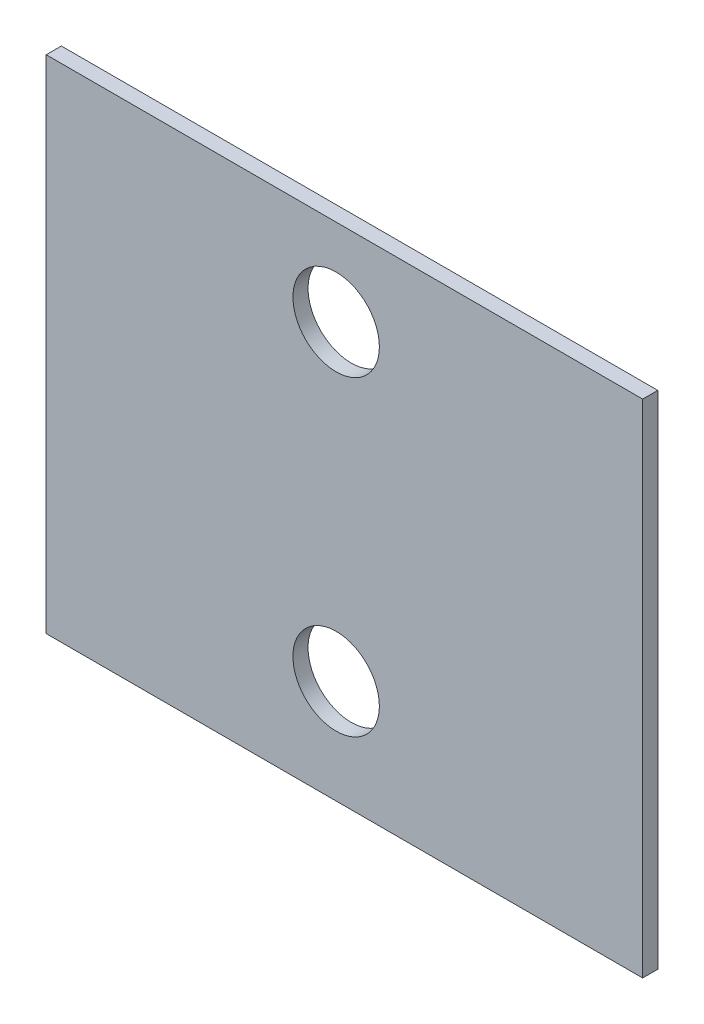
ISO-10303-21;
HEADER;
FILE_DESCRIPTION(('STEP AP214'),'2;1');
FILE_NAME('part.step','',(''),(''),'','','');
FILE_SCHEMA(('AUTOMOTIVE_DESIGN { 1 0 10303 214 1 1 1 1 }'));
ENDSEC;
DATA;
#1=APPLICATION_CONTEXT('core data for automotive mechanical design processes');
#2=APPLICATION_PROTOCOL_DEFINITION('international standard','automotive_design',2000,#1);
#3=PRODUCT_CONTEXT('',#1,'mechanical');
#4=PRODUCT('Part','Part','',(#3));
#5=PRODUCT_RELATED_PRODUCT_CATEGORY('part','',(#4));
#6=PRODUCT_DEFINITION_FORMATION('','',#4);
#7=PRODUCT_DEFINITION_CONTEXT('part definition',#1,'design');
#8=PRODUCT_DEFINITION('design','',#6,#7);
#9=PRODUCT_DEFINITION_SHAPE('','',#8);
#10=(LENGTH_UNIT() NAMED_UNIT(*) SI_UNIT(.MILLI.,.METRE.));
#11=(NAMED_UNIT(*) PLANE_ANGLE_UNIT() SI_UNIT($,.RADIAN.));
#12=(NAMED_UNIT(*) SI_UNIT($,.STERADIAN.) SOLID_ANGLE_UNIT());
#13=UNCERTAINTY_MEASURE_WITH_UNIT(LENGTH_MEASURE(1.E-05),#10,'distance_accuracy_value','');
#14=(GEOMETRIC_REPRESENTATION_CONTEXT(3) GLOBAL_UNCERTAINTY_ASSIGNED_CONTEXT((#13)) GLOBAL_UNIT_ASSIGNED_CONTEXT((#10,
#11,#12)) REPRESENTATION_CONTEXT('',''));
#15=CARTESIAN_POINT('',(0.,0.,0.));
#16=DIRECTION('',(0.,0.,1.));
#17=DIRECTION('',(1.,0.,0.));
#18=AXIS2_PLACEMENT_3D('',#15,#16,#17);
#19=CARTESIAN_POINT('',(0.,0.,1.75));
#20=DIRECTION('',(0.,0.,1.));
#21=DIRECTION('',(1.,0.,0.));
#22=AXIS2_PLACEMENT_3D('',#19,#20,#21);
#23=PLANE('',#22);
#24=CARTESIAN_POINT('',(-2.95837358432269,17.5,1.75));
#25=DIRECTION('',(0.,0.,1.));
#26=DIRECTION('',(1.,0.,0.));
#27=AXIS2_PLACEMENT_3D('',#24,#25,#26);
#28=CIRCLE('',#27,5.);
#29=CARTESIAN_POINT('',(2.04162641567731,17.5,1.75));
#30=VERTEX_POINT('',#29);
#31=EDGE_CURVE('E100',#30,#30,#28,.T.);
#32=ORIENTED_EDGE('',*,*,#31,.F.);
#33=EDGE_LOOP('',(#32));
#34=FACE_BOUND('',#33,.T.);
#35=DIRECTION('',(0.,1.,0.));
#36=VECTOR('',#35,1.);
#37=CARTESIAN_POINT('',(32.5,27.5,1.75));
#38=LINE('',#37,#36);
#39=CARTESIAN_POINT('',(32.5,-30.5,1.75));
#40=VERTEX_POINT('',#39);
#41=CARTESIAN_POINT('',(32.5,27.5,1.75));
#42=VERTEX_POINT('',#41);
#43=EDGE_CURVE('E85',#40,#42,#38,.T.);
#44=ORIENTED_EDGE('',*,*,#43,.T.);
#45=DIRECTION('',(-1.,0.,0.));
#46=VECTOR('',#45,1.);
#47=CARTESIAN_POINT('',(-36.5,27.5,1.75));
#48=LINE('',#47,#46);
#49=CARTESIAN_POINT('',(-36.5,27.5,1.75));
#50=VERTEX_POINT('',#49);
#51=EDGE_CURVE('E80',#42,#50,#48,.T.);
#52=ORIENTED_EDGE('',*,*,#51,.T.);
#53=DIRECTION('',(0.,-1.,0.));
#54=VECTOR('',#53,1.);
#55=CARTESIAN_POINT('',(-36.5,27.5,1.75));
#56=LINE('',#55,#54);
#57=CARTESIAN_POINT('',(-36.5,-30.5,1.75));
#58=VERTEX_POINT('',#57);
#59=EDGE_CURVE('E83',#50,#58,#56,.T.);
#60=ORIENTED_EDGE('',*,*,#59,.T.);
#61=DIRECTION('',(1.,0.,0.));
#62=VECTOR('',#61,1.);
#63=CARTESIAN_POINT('',(-36.5,-30.5,1.75));
#64=LINE('',#63,#62);
#65=EDGE_CURVE('E50',#58,#40,#64,.T.);
#66=ORIENTED_EDGE('',*,*,#65,.T.);
#67=EDGE_LOOP('',(#44,#52,#60,#66));
#68=FACE_BOUND('',#67,.T.);
#69=CARTESIAN_POINT('',(-2.95837358432268,-18.5,1.75));
#70=DIRECTION('',(0.,0.,1.));
#71=DIRECTION('',(1.,0.,0.));
#72=AXIS2_PLACEMENT_3D('',#69,#70,#71);
#73=CIRCLE('',#72,5.);
#74=CARTESIAN_POINT('',(2.04162641567732,-18.5,1.75));
#75=VERTEX_POINT('',#74);
#76=EDGE_CURVE('E115',#75,#75,#73,.T.);
#77=ORIENTED_EDGE('',*,*,#76,.F.);
#78=EDGE_LOOP('',(#77));
#79=FACE_BOUND('',#78,.T.);
#80=ADVANCED_FACE('F33',(#34,#68,#79),#23,.T.);
#81=CARTESIAN_POINT('',(0.,0.,0.));
#82=DIRECTION('',(0.,0.,1.));
#83=DIRECTION('',(1.,0.,0.));
#84=AXIS2_PLACEMENT_3D('',#81,#82,#83);
#85=PLANE('',#84);
#86=DIRECTION('',(0.,1.,0.));
#87=VECTOR('',#86,1.);
#88=CARTESIAN_POINT('',(32.5,27.5,0.));
#89=LINE('',#88,#87);
#90=CARTESIAN_POINT('',(32.5,-30.5,0.));
#91=VERTEX_POINT('',#90);
#92=CARTESIAN_POINT('',(32.5,27.5,0.));
#93=VERTEX_POINT('',#92);
#94=EDGE_CURVE('E97',#91,#93,#89,.T.);
#95=ORIENTED_EDGE('',*,*,#94,.F.);
#96=DIRECTION('',(1.,0.,0.));
#97=VECTOR('',#96,1.);
#98=CARTESIAN_POINT('',(-36.5,-30.5,0.));
#99=LINE('',#98,#97);
#100=CARTESIAN_POINT('',(-36.5,-30.5,0.));
#101=VERTEX_POINT('',#100);
#102=EDGE_CURVE('E73',#101,#91,#99,.T.);
#103=ORIENTED_EDGE('',*,*,#102,.F.);
#104=DIRECTION('',(0.,-1.,0.));
#105=VECTOR('',#104,1.);
#106=CARTESIAN_POINT('',(-36.5,27.5,0.));
#107=LINE('',#106,#105);
#108=CARTESIAN_POINT('',(-36.5,27.5,0.));
#109=VERTEX_POINT('',#108);
#110=EDGE_CURVE('E67',#109,#101,#107,.T.);
#111=ORIENTED_EDGE('',*,*,#110,.F.);
#112=DIRECTION('',(-1.,0.,0.));
#113=VECTOR('',#112,1.);
#114=CARTESIAN_POINT('',(-36.5,27.5,0.));
#115=LINE('',#114,#113);
#116=EDGE_CURVE('E89',#93,#109,#115,.T.);
#117=ORIENTED_EDGE('',*,*,#116,.F.);
#118=EDGE_LOOP('',(#95,#103,#111,#117));
#119=FACE_BOUND('',#118,.T.);
#120=CARTESIAN_POINT('',(-2.95837358432269,17.5,0.));
#121=DIRECTION('',(0.,0.,1.));
#122=DIRECTION('',(1.,0.,0.));
#123=AXIS2_PLACEMENT_3D('',#120,#121,#122);
#124=CIRCLE('',#123,5.);
#125=CARTESIAN_POINT('',(2.04162641567731,17.5,0.));
#126=VERTEX_POINT('',#125);
#127=EDGE_CURVE('E112',#126,#126,#124,.T.);
#128=ORIENTED_EDGE('',*,*,#127,.T.);
#129=EDGE_LOOP('',(#128));
#130=FACE_BOUND('',#129,.T.);
#131=CARTESIAN_POINT('',(-2.95837358432268,-18.5,0.));
#132=DIRECTION('',(0.,0.,1.));
#133=DIRECTION('',(1.,0.,0.));
#134=AXIS2_PLACEMENT_3D('',#131,#132,#133);
#135=CIRCLE('',#134,5.);
#136=CARTESIAN_POINT('',(2.04162641567732,-18.5,0.));
#137=VERTEX_POINT('',#136);
#138=EDGE_CURVE('E118',#137,#137,#135,.T.);
#139=ORIENTED_EDGE('',*,*,#138,.T.);
#140=EDGE_LOOP('',(#139));
#141=FACE_BOUND('',#140,.T.);
#142=ADVANCED_FACE('F108',(#119,#130,#141),#85,.F.);
#143=CARTESIAN_POINT('',(32.5,27.5,1.75));
#144=DIRECTION('',(-1.,0.,0.));
#145=DIRECTION('',(0.,-1.,0.));
#146=AXIS2_PLACEMENT_3D('',#143,#144,#145);
#147=PLANE('',#146);
#148=ORIENTED_EDGE('',*,*,#94,.T.);
#149=DIRECTION('',(0.,0.,-1.));
#150=VECTOR('',#149,1.);
#151=CARTESIAN_POINT('',(32.5,27.5,1.75));
#152=LINE('',#151,#150);
#153=EDGE_CURVE('E11',#42,#93,#152,.T.);
#154=ORIENTED_EDGE('',*,*,#153,.F.);
#155=ORIENTED_EDGE('',*,*,#43,.F.);
#156=DIRECTION('',(0.,0.,-1.));
#157=VECTOR('',#156,1.);
#158=CARTESIAN_POINT('',(32.5,-30.5,1.75));
#159=LINE('',#158,#157);
#160=EDGE_CURVE('E93',#40,#91,#159,.T.);
#161=ORIENTED_EDGE('',*,*,#160,.T.);
#162=EDGE_LOOP('',(#148,#154,#155,#161));
#163=FACE_BOUND('',#162,.T.);
#164=ADVANCED_FACE('F35',(#163),#147,.F.);
#165=CARTESIAN_POINT('',(-36.5,27.5,1.75));
#166=DIRECTION('',(0.,-1.,0.));
#167=DIRECTION('',(0.,0.,-1.));
#168=AXIS2_PLACEMENT_3D('',#165,#166,#167);
#169=PLANE('',#168);
#170=ORIENTED_EDGE('',*,*,#116,.T.);
#171=DIRECTION('',(0.,0.,-1.));
#172=VECTOR('',#171,1.);
#173=CARTESIAN_POINT('',(-36.5,27.5,1.75));
#174=LINE('',#173,#172);
#175=EDGE_CURVE('E42',#50,#109,#174,.T.);
#176=ORIENTED_EDGE('',*,*,#175,.F.);
#177=ORIENTED_EDGE('',*,*,#51,.F.);
#178=ORIENTED_EDGE('',*,*,#153,.T.);
#179=EDGE_LOOP('',(#170,#176,#177,#178));
#180=FACE_BOUND('',#179,.T.);
#181=ADVANCED_FACE('F88',(#180),#169,.F.);
#182=CARTESIAN_POINT('',(-36.5,27.5,1.75));
#183=DIRECTION('',(1.,0.,0.));
#184=DIRECTION('',(0.,1.,0.));
#185=AXIS2_PLACEMENT_3D('',#182,#183,#184);
#186=PLANE('',#185);
#187=ORIENTED_EDGE('',*,*,#110,.T.);
#188=DIRECTION('',(0.,0.,-1.));
#189=VECTOR('',#188,1.);
#190=CARTESIAN_POINT('',(-36.5,-30.5,1.75));
#191=LINE('',#190,#189);
#192=EDGE_CURVE('E90',#58,#101,#191,.T.);
#193=ORIENTED_EDGE('',*,*,#192,.F.);
#194=ORIENTED_EDGE('',*,*,#59,.F.);
#195=ORIENTED_EDGE('',*,*,#175,.T.);
#196=EDGE_LOOP('',(#187,#193,#194,#195));
#197=FACE_BOUND('',#196,.T.);
#198=ADVANCED_FACE('F91',(#197),#186,.F.);
#199=CARTESIAN_POINT('',(-36.5,-30.5,1.75));
#200=DIRECTION('',(0.,1.,0.));
#201=DIRECTION('',(0.,0.,1.));
#202=AXIS2_PLACEMENT_3D('',#199,#200,#201);
#203=PLANE('',#202);
#204=ORIENTED_EDGE('',*,*,#102,.T.);
#205=ORIENTED_EDGE('',*,*,#160,.F.);
#206=ORIENTED_EDGE('',*,*,#65,.F.);
#207=ORIENTED_EDGE('',*,*,#192,.T.);
#208=EDGE_LOOP('',(#204,#205,#206,#207));
#209=FACE_BOUND('',#208,.T.);
#210=ADVANCED_FACE('F105',(#209),#203,.F.);
#211=CARTESIAN_POINT('',(-2.95837358432269,17.5,1.75));
#212=DIRECTION('',(0.,0.,-1.));
#213=DIRECTION('',(-1.,0.,0.));
#214=AXIS2_PLACEMENT_3D('',#211,#212,#213);
#215=CYLINDRICAL_SURFACE('',#214,5.);
#216=ORIENTED_EDGE('',*,*,#31,.T.);
#217=EDGE_LOOP('',(#216));
#218=FACE_BOUND('',#217,.T.);
#219=ORIENTED_EDGE('',*,*,#127,.F.);
#220=EDGE_LOOP('',(#219));
#221=FACE_BOUND('',#220,.T.);
#222=ADVANCED_FACE('F135',(#218,#221),#215,.F.);
#223=CARTESIAN_POINT('',(-2.95837358432268,-18.5,1.75));
#224=DIRECTION('',(0.,0.,-1.));
#225=DIRECTION('',(-1.,0.,0.));
#226=AXIS2_PLACEMENT_3D('',#223,#224,#225);
#227=CYLINDRICAL_SURFACE('',#226,5.);
#228=ORIENTED_EDGE('',*,*,#76,.T.);
#229=EDGE_LOOP('',(#228));
#230=FACE_BOUND('',#229,.T.);
#231=ORIENTED_EDGE('',*,*,#138,.F.);
#232=EDGE_LOOP('',(#231));
#233=FACE_BOUND('',#232,.T.);
#234=ADVANCED_FACE('F124',(#230,#233),#227,.F.);
#235=CLOSED_SHELL('',(#80,#142,#164,#181,#198,#210,#222,#234));
#236=MANIFOLD_SOLID_BREP('B2',#235);
#237=ADVANCED_BREP_SHAPE_REPRESENTATION('',(#18,#236),#14);
#238=SHAPE_DEFINITION_REPRESENTATION(#9,#237);
ENDSEC;
END-ISO-10303-21;
